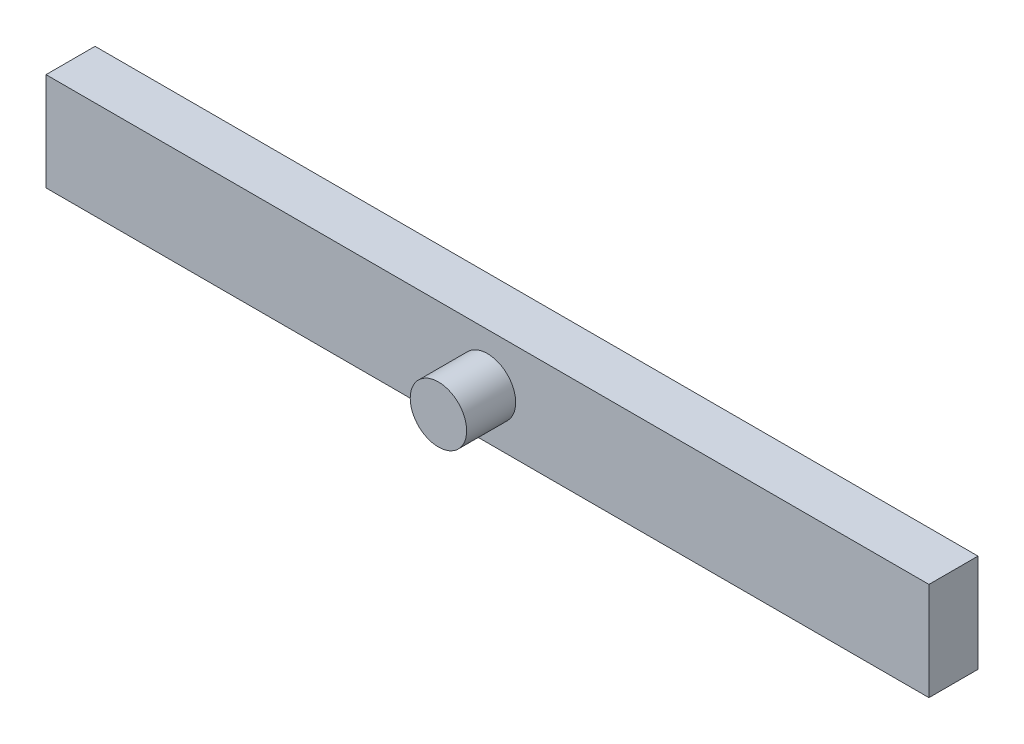
ISO-10303-21;
HEADER;
FILE_DESCRIPTION(('STEP AP214'),'2;1');
FILE_NAME('part.step','',(''),(''),'','','');
FILE_SCHEMA(('AUTOMOTIVE_DESIGN { 1 0 10303 214 1 1 1 1 }'));
ENDSEC;
DATA;
#1=APPLICATION_CONTEXT('core data for automotive mechanical design processes');
#2=APPLICATION_PROTOCOL_DEFINITION('international standard','automotive_design',2000,#1);
#3=PRODUCT_CONTEXT('',#1,'mechanical');
#4=PRODUCT('Part','Part','',(#3));
#5=PRODUCT_RELATED_PRODUCT_CATEGORY('part','',(#4));
#6=PRODUCT_DEFINITION_FORMATION('','',#4);
#7=PRODUCT_DEFINITION_CONTEXT('part definition',#1,'design');
#8=PRODUCT_DEFINITION('design','',#6,#7);
#9=PRODUCT_DEFINITION_SHAPE('','',#8);
#10=(LENGTH_UNIT() NAMED_UNIT(*) SI_UNIT(.MILLI.,.METRE.));
#11=(NAMED_UNIT(*) PLANE_ANGLE_UNIT() SI_UNIT($,.RADIAN.));
#12=(NAMED_UNIT(*) SI_UNIT($,.STERADIAN.) SOLID_ANGLE_UNIT());
#13=UNCERTAINTY_MEASURE_WITH_UNIT(LENGTH_MEASURE(1.E-05),#10,'distance_accuracy_value','');
#14=(GEOMETRIC_REPRESENTATION_CONTEXT(3) GLOBAL_UNCERTAINTY_ASSIGNED_CONTEXT((#13)) GLOBAL_UNIT_ASSIGNED_CONTEXT((#10,
#11,#12)) REPRESENTATION_CONTEXT('',''));
#15=CARTESIAN_POINT('',(0.,0.,0.));
#16=DIRECTION('',(0.,0.,1.));
#17=DIRECTION('',(1.,0.,0.));
#18=AXIS2_PLACEMENT_3D('',#15,#16,#17);
#19=CARTESIAN_POINT('',(0.,5.,-5.));
#20=DIRECTION('',(0.,1.,0.));
#21=DIRECTION('',(0.,0.,1.));
#22=AXIS2_PLACEMENT_3D('',#19,#20,#21);
#23=PLANE('',#22);
#24=DIRECTION('',(-1.,0.,0.));
#25=VECTOR('',#24,1.);
#26=CARTESIAN_POINT('',(0.,5.,0.));
#27=LINE('',#26,#25);
#28=CARTESIAN_POINT('',(45.,5.,0.));
#29=VERTEX_POINT('',#28);
#30=CARTESIAN_POINT('',(-45.,5.,0.));
#31=VERTEX_POINT('',#30);
#32=EDGE_CURVE('E106',#29,#31,#27,.T.);
#33=ORIENTED_EDGE('',*,*,#32,.F.);
#34=DIRECTION('',(0.,0.,1.));
#35=VECTOR('',#34,1.);
#36=CARTESIAN_POINT('',(45.,5.,-5.));
#37=LINE('',#36,#35);
#38=CARTESIAN_POINT('',(45.,5.,-5.));
#39=VERTEX_POINT('',#38);
#40=EDGE_CURVE('E49',#39,#29,#37,.T.);
#41=ORIENTED_EDGE('',*,*,#40,.F.);
#42=DIRECTION('',(-1.,0.,0.));
#43=VECTOR('',#42,1.);
#44=CARTESIAN_POINT('',(-45.,5.,-5.));
#45=LINE('',#44,#43);
#46=CARTESIAN_POINT('',(-45.,5.,-5.));
#47=VERTEX_POINT('',#46);
#48=EDGE_CURVE('E57',#39,#47,#45,.T.);
#49=ORIENTED_EDGE('',*,*,#48,.T.);
#50=DIRECTION('',(0.,0.,1.));
#51=VECTOR('',#50,1.);
#52=CARTESIAN_POINT('',(-45.,5.,-5.));
#53=LINE('',#52,#51);
#54=EDGE_CURVE('E87',#47,#31,#53,.T.);
#55=ORIENTED_EDGE('',*,*,#54,.T.);
#56=EDGE_LOOP('',(#33,#41,#49,#55));
#57=FACE_BOUND('',#56,.T.);
#58=ADVANCED_FACE('F39',(#57),#23,.T.);
#59=CARTESIAN_POINT('',(45.,5.,-5.));
#60=DIRECTION('',(1.,0.,0.));
#61=DIRECTION('',(0.,0.,-1.));
#62=AXIS2_PLACEMENT_3D('',#59,#60,#61);
#63=PLANE('',#62);
#64=DIRECTION('',(0.,1.,0.));
#65=VECTOR('',#64,1.);
#66=CARTESIAN_POINT('',(45.,5.,0.));
#67=LINE('',#66,#65);
#68=CARTESIAN_POINT('',(45.,-5.,0.));
#69=VERTEX_POINT('',#68);
#70=EDGE_CURVE('E118',#69,#29,#67,.T.);
#71=ORIENTED_EDGE('',*,*,#70,.F.);
#72=DIRECTION('',(0.,0.,1.));
#73=VECTOR('',#72,1.);
#74=CARTESIAN_POINT('',(45.,-5.,-5.));
#75=LINE('',#74,#73);
#76=CARTESIAN_POINT('',(45.,-5.,-5.));
#77=VERTEX_POINT('',#76);
#78=EDGE_CURVE('E74',#77,#69,#75,.T.);
#79=ORIENTED_EDGE('',*,*,#78,.F.);
#80=DIRECTION('',(0.,1.,0.));
#81=VECTOR('',#80,1.);
#82=CARTESIAN_POINT('',(45.,5.,-5.));
#83=LINE('',#82,#81);
#84=EDGE_CURVE('E100',#77,#39,#83,.T.);
#85=ORIENTED_EDGE('',*,*,#84,.T.);
#86=ORIENTED_EDGE('',*,*,#40,.T.);
#87=EDGE_LOOP('',(#71,#79,#85,#86));
#88=FACE_BOUND('',#87,.T.);
#89=ADVANCED_FACE('F131',(#88),#63,.T.);
#90=CARTESIAN_POINT('',(45.,-5.,-5.));
#91=DIRECTION('',(0.,-1.,0.));
#92=DIRECTION('',(1.,0.,0.));
#93=AXIS2_PLACEMENT_3D('',#90,#91,#92);
#94=PLANE('',#93);
#95=DIRECTION('',(1.,0.,0.));
#96=VECTOR('',#95,1.);
#97=CARTESIAN_POINT('',(45.,-5.,0.));
#98=LINE('',#97,#96);
#99=CARTESIAN_POINT('',(-45.,-5.00000000000001,0.));
#100=VERTEX_POINT('',#99);
#101=EDGE_CURVE('E94',#100,#69,#98,.T.);
#102=ORIENTED_EDGE('',*,*,#101,.F.);
#103=DIRECTION('',(0.,0.,1.));
#104=VECTOR('',#103,1.);
#105=CARTESIAN_POINT('',(-45.,-5.00000000000001,-5.));
#106=LINE('',#105,#104);
#107=CARTESIAN_POINT('',(-45.,-5.00000000000001,-5.));
#108=VERTEX_POINT('',#107);
#109=EDGE_CURVE('E89',#108,#100,#106,.T.);
#110=ORIENTED_EDGE('',*,*,#109,.F.);
#111=DIRECTION('',(1.,0.,0.));
#112=VECTOR('',#111,1.);
#113=CARTESIAN_POINT('',(45.,-5.,-5.));
#114=LINE('',#113,#112);
#115=EDGE_CURVE('E92',#108,#77,#114,.T.);
#116=ORIENTED_EDGE('',*,*,#115,.T.);
#117=ORIENTED_EDGE('',*,*,#78,.T.);
#118=EDGE_LOOP('',(#102,#110,#116,#117));
#119=FACE_BOUND('',#118,.T.);
#120=ADVANCED_FACE('F91',(#119),#94,.T.);
#121=CARTESIAN_POINT('',(-45.,-5.00000000000001,-5.));
#122=DIRECTION('',(-1.,0.,0.));
#123=DIRECTION('',(0.,0.,1.));
#124=AXIS2_PLACEMENT_3D('',#121,#122,#123);
#125=PLANE('',#124);
#126=DIRECTION('',(0.,-1.,0.));
#127=VECTOR('',#126,1.);
#128=CARTESIAN_POINT('',(-45.,-5.00000000000001,0.));
#129=LINE('',#128,#127);
#130=EDGE_CURVE('E112',#31,#100,#129,.T.);
#131=ORIENTED_EDGE('',*,*,#130,.F.);
#132=ORIENTED_EDGE('',*,*,#54,.F.);
#133=DIRECTION('',(0.,-1.,0.));
#134=VECTOR('',#133,1.);
#135=CARTESIAN_POINT('',(-45.,-5.00000000000001,-5.));
#136=LINE('',#135,#134);
#137=EDGE_CURVE('E99',#47,#108,#136,.T.);
#138=ORIENTED_EDGE('',*,*,#137,.T.);
#139=ORIENTED_EDGE('',*,*,#109,.T.);
#140=EDGE_LOOP('',(#131,#132,#138,#139));
#141=FACE_BOUND('',#140,.T.);
#142=ADVANCED_FACE('F41',(#141),#125,.T.);
#143=CARTESIAN_POINT('',(0.,0.,-5.));
#144=DIRECTION('',(0.,0.,-1.));
#145=DIRECTION('',(-1.,0.,0.));
#146=AXIS2_PLACEMENT_3D('',#143,#144,#145);
#147=PLANE('',#146);
#148=ORIENTED_EDGE('',*,*,#48,.F.);
#149=ORIENTED_EDGE('',*,*,#84,.F.);
#150=ORIENTED_EDGE('',*,*,#115,.F.);
#151=ORIENTED_EDGE('',*,*,#137,.F.);
#152=EDGE_LOOP('',(#148,#149,#150,#151));
#153=FACE_BOUND('',#152,.T.);
#154=ADVANCED_FACE('F98',(#153),#147,.T.);
#155=CARTESIAN_POINT('',(0.,0.,0.));
#156=DIRECTION('',(0.,0.,-1.));
#157=DIRECTION('',(-1.,0.,0.));
#158=AXIS2_PLACEMENT_3D('',#155,#156,#157);
#159=PLANE('',#158);
#160=CARTESIAN_POINT('',(0.,0.,0.));
#161=DIRECTION('',(0.,0.,-1.));
#162=DIRECTION('',(-1.,0.,0.));
#163=AXIS2_PLACEMENT_3D('',#160,#161,#162);
#164=CIRCLE('',#163,2.875);
#165=CARTESIAN_POINT('',(-2.875,0.,0.));
#166=VERTEX_POINT('',#165);
#167=EDGE_CURVE('E11',#166,#166,#164,.F.);
#168=ORIENTED_EDGE('',*,*,#167,.F.);
#169=EDGE_LOOP('',(#168));
#170=FACE_BOUND('',#169,.T.);
#171=ORIENTED_EDGE('',*,*,#32,.T.);
#172=ORIENTED_EDGE('',*,*,#130,.T.);
#173=ORIENTED_EDGE('',*,*,#101,.T.);
#174=ORIENTED_EDGE('',*,*,#70,.T.);
#175=EDGE_LOOP('',(#171,#172,#173,#174));
#176=FACE_BOUND('',#175,.T.);
#177=ADVANCED_FACE('F130',(#170,#176),#159,.F.);
#178=CARTESIAN_POINT('',(0.,0.,5.));
#179=DIRECTION('',(0.,0.,-1.));
#180=DIRECTION('',(-1.,0.,0.));
#181=AXIS2_PLACEMENT_3D('',#178,#179,#180);
#182=CYLINDRICAL_SURFACE('',#181,2.875);
#183=CARTESIAN_POINT('',(0.,0.,5.));
#184=DIRECTION('',(0.,0.,1.));
#185=DIRECTION('',(1.,0.,0.));
#186=AXIS2_PLACEMENT_3D('',#183,#184,#185);
#187=CIRCLE('',#186,2.875);
#188=CARTESIAN_POINT('',(2.875,0.,5.));
#189=VERTEX_POINT('',#188);
#190=EDGE_CURVE('E115',#189,#189,#187,.T.);
#191=ORIENTED_EDGE('',*,*,#190,.F.);
#192=EDGE_LOOP('',(#191));
#193=FACE_BOUND('',#192,.T.);
#194=ORIENTED_EDGE('',*,*,#167,.T.);
#195=EDGE_LOOP('',(#194));
#196=FACE_BOUND('',#195,.T.);
#197=ADVANCED_FACE('F142',(#193,#196),#182,.T.);
#198=CARTESIAN_POINT('',(0.,0.,5.));
#199=DIRECTION('',(0.,0.,1.));
#200=DIRECTION('',(1.,0.,0.));
#201=AXIS2_PLACEMENT_3D('',#198,#199,#200);
#202=PLANE('',#201);
#203=ORIENTED_EDGE('',*,*,#190,.T.);
#204=EDGE_LOOP('',(#203));
#205=FACE_BOUND('',#204,.T.);
#206=ADVANCED_FACE('F148',(#205),#202,.T.);
#207=CLOSED_SHELL('',(#58,#89,#120,#142,#154,#177,#197,#206));
#208=MANIFOLD_SOLID_BREP('B2',#207);
#209=ADVANCED_BREP_SHAPE_REPRESENTATION('',(#18,#208),#14);
#210=SHAPE_DEFINITION_REPRESENTATION(#9,#209);
ENDSEC;
END-ISO-10303-21;
